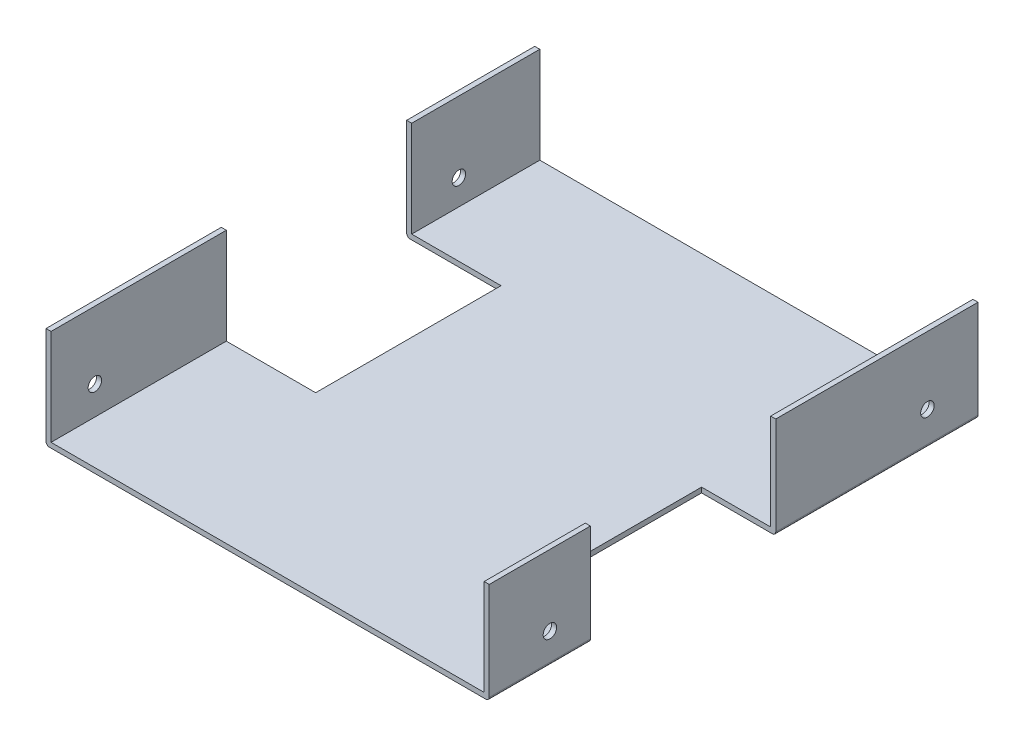
ISO-10303-21;
HEADER;
FILE_DESCRIPTION(('STEP AP214'),'2;1');
FILE_NAME('part.step','',(''),(''),'','','');
FILE_SCHEMA(('AUTOMOTIVE_DESIGN { 1 0 10303 214 1 1 1 1 }'));
ENDSEC;
DATA;
#1=APPLICATION_CONTEXT('core data for automotive mechanical design processes');
#2=APPLICATION_PROTOCOL_DEFINITION('international standard','automotive_design',2000,#1);
#3=PRODUCT_CONTEXT('',#1,'mechanical');
#4=PRODUCT('Part','Part','',(#3));
#5=PRODUCT_RELATED_PRODUCT_CATEGORY('part','',(#4));
#6=PRODUCT_DEFINITION_FORMATION('','',#4);
#7=PRODUCT_DEFINITION_CONTEXT('part definition',#1,'design');
#8=PRODUCT_DEFINITION('design','',#6,#7);
#9=PRODUCT_DEFINITION_SHAPE('','',#8);
#10=(LENGTH_UNIT() NAMED_UNIT(*) SI_UNIT(.MILLI.,.METRE.));
#11=(NAMED_UNIT(*) PLANE_ANGLE_UNIT() SI_UNIT($,.RADIAN.));
#12=(NAMED_UNIT(*) SI_UNIT($,.STERADIAN.) SOLID_ANGLE_UNIT());
#13=UNCERTAINTY_MEASURE_WITH_UNIT(LENGTH_MEASURE(1.E-05),#10,'distance_accuracy_value','');
#14=(GEOMETRIC_REPRESENTATION_CONTEXT(3) GLOBAL_UNCERTAINTY_ASSIGNED_CONTEXT((#13)) GLOBAL_UNIT_ASSIGNED_CONTEXT((#10,
#11,#12)) REPRESENTATION_CONTEXT('',''));
#15=CARTESIAN_POINT('',(0.,0.,0.));
#16=DIRECTION('',(0.,0.,1.));
#17=DIRECTION('',(1.,0.,0.));
#18=AXIS2_PLACEMENT_3D('',#15,#16,#17);
#19=CARTESIAN_POINT('',(-64.75,-15.5,72.5));
#20=DIRECTION('',(0.,1.,0.));
#21=DIRECTION('',(-1.,0.,0.));
#22=AXIS2_PLACEMENT_3D('',#19,#20,#21);
#23=PLANE('',#22);
#24=DIRECTION('',(-1.,0.,0.));
#25=VECTOR('',#24,1.);
#26=CARTESIAN_POINT('',(-64.75,-15.5,42.5));
#27=LINE('',#26,#25);
#28=CARTESIAN_POINT('',(64.75,-15.5,42.5));
#29=VERTEX_POINT('',#28);
#30=CARTESIAN_POINT('',(43.75,-15.5,42.5));
#31=VERTEX_POINT('',#30);
#32=EDGE_CURVE('E206',#29,#31,#27,.T.);
#33=ORIENTED_EDGE('',*,*,#32,.F.);
#34=DIRECTION('',(0.,0.,-1.));
#35=VECTOR('',#34,1.);
#36=CARTESIAN_POINT('',(64.75,-15.5,72.5));
#37=LINE('',#36,#35);
#38=CARTESIAN_POINT('',(64.75,-15.5,72.5));
#39=VERTEX_POINT('',#38);
#40=EDGE_CURVE('E336',#39,#29,#37,.T.);
#41=ORIENTED_EDGE('',*,*,#40,.F.);
#42=DIRECTION('',(1.,0.,0.));
#43=VECTOR('',#42,1.);
#44=CARTESIAN_POINT('',(-64.75,-15.5,72.5));
#45=LINE('',#44,#43);
#46=CARTESIAN_POINT('',(-64.75,-15.5,72.5));
#47=VERTEX_POINT('',#46);
#48=EDGE_CURVE('E265',#47,#39,#45,.T.);
#49=ORIENTED_EDGE('',*,*,#48,.F.);
#50=DIRECTION('',(0.,0.,-1.));
#51=VECTOR('',#50,1.);
#52=CARTESIAN_POINT('',(-64.75,-15.5,72.5));
#53=LINE('',#52,#51);
#54=CARTESIAN_POINT('',(-64.75,-15.5,20.5));
#55=VERTEX_POINT('',#54);
#56=EDGE_CURVE('E340',#47,#55,#53,.T.);
#57=ORIENTED_EDGE('',*,*,#56,.T.);
#58=DIRECTION('',(-1.,0.,0.));
#59=VECTOR('',#58,1.);
#60=CARTESIAN_POINT('',(-64.75,-15.5,20.5));
#61=LINE('',#60,#59);
#62=CARTESIAN_POINT('',(-37.75,-15.5,20.5));
#63=VERTEX_POINT('',#62);
#64=EDGE_CURVE('E244',#63,#55,#61,.T.);
#65=ORIENTED_EDGE('',*,*,#64,.F.);
#66=DIRECTION('',(0.,0.,1.));
#67=VECTOR('',#66,1.);
#68=CARTESIAN_POINT('',(-37.75,-15.5,72.5));
#69=LINE('',#68,#67);
#70=CARTESIAN_POINT('',(-37.75,-15.5,-34.5));
#71=VERTEX_POINT('',#70);
#72=EDGE_CURVE('E256',#71,#63,#69,.T.);
#73=ORIENTED_EDGE('',*,*,#72,.F.);
#74=DIRECTION('',(1.,0.,0.));
#75=VECTOR('',#74,1.);
#76=CARTESIAN_POINT('',(-64.75,-15.5,-34.5));
#77=LINE('',#76,#75);
#78=CARTESIAN_POINT('',(-64.75,-15.5,-34.5));
#79=VERTEX_POINT('',#78);
#80=EDGE_CURVE('E252',#79,#71,#77,.T.);
#81=ORIENTED_EDGE('',*,*,#80,.F.);
#82=CARTESIAN_POINT('',(-64.75,-15.5,-72.5));
#83=VERTEX_POINT('',#82);
#84=EDGE_CURVE('E339',#79,#83,#53,.T.);
#85=ORIENTED_EDGE('',*,*,#84,.T.);
#86=DIRECTION('',(1.,0.,0.));
#87=VECTOR('',#86,1.);
#88=CARTESIAN_POINT('',(-64.75,-15.5,-72.5));
#89=LINE('',#88,#87);
#90=CARTESIAN_POINT('',(64.75,-15.5,-72.5));
#91=VERTEX_POINT('',#90);
#92=EDGE_CURVE('E287',#83,#91,#89,.T.);
#93=ORIENTED_EDGE('',*,*,#92,.T.);
#94=CARTESIAN_POINT('',(64.75,-15.5,-12.5));
#95=VERTEX_POINT('',#94);
#96=EDGE_CURVE('E217',#95,#91,#37,.T.);
#97=ORIENTED_EDGE('',*,*,#96,.F.);
#98=DIRECTION('',(1.,0.,0.));
#99=VECTOR('',#98,1.);
#100=CARTESIAN_POINT('',(-64.75,-15.5,-12.5));
#101=LINE('',#100,#99);
#102=CARTESIAN_POINT('',(43.75,-15.5,-12.5));
#103=VERTEX_POINT('',#102);
#104=EDGE_CURVE('E209',#103,#95,#101,.T.);
#105=ORIENTED_EDGE('',*,*,#104,.F.);
#106=DIRECTION('',(0.,0.,-1.));
#107=VECTOR('',#106,1.);
#108=CARTESIAN_POINT('',(43.75,-15.5,72.5));
#109=LINE('',#108,#107);
#110=EDGE_CURVE('E196',#31,#103,#109,.T.);
#111=ORIENTED_EDGE('',*,*,#110,.F.);
#112=EDGE_LOOP('',(#33,#41,#49,#57,#65,#73,#81,#85,#93,#97,#105,#111));
#113=FACE_BOUND('',#112,.T.);
#114=ADVANCED_FACE('F33',(#113),#23,.F.);
#115=CARTESIAN_POINT('',(-64.25,-14.,72.5));
#116=DIRECTION('',(0.,-1.,0.));
#117=DIRECTION('',(0.,0.,-1.));
#118=AXIS2_PLACEMENT_3D('',#115,#116,#117);
#119=PLANE('',#118);
#120=DIRECTION('',(1.,0.,0.));
#121=VECTOR('',#120,1.);
#122=CARTESIAN_POINT('',(-64.25,-14.,42.5));
#123=LINE('',#122,#121);
#124=CARTESIAN_POINT('',(43.75,-14.,42.5));
#125=VERTEX_POINT('',#124);
#126=CARTESIAN_POINT('',(64.25,-14.,42.5));
#127=VERTEX_POINT('',#126);
#128=EDGE_CURVE('E221',#125,#127,#123,.T.);
#129=ORIENTED_EDGE('',*,*,#128,.F.);
#130=DIRECTION('',(0.,0.,1.));
#131=VECTOR('',#130,1.);
#132=CARTESIAN_POINT('',(43.75,-14.,72.5));
#133=LINE('',#132,#131);
#134=CARTESIAN_POINT('',(43.75,-14.,-12.5));
#135=VERTEX_POINT('',#134);
#136=EDGE_CURVE('E11',#135,#125,#133,.T.);
#137=ORIENTED_EDGE('',*,*,#136,.F.);
#138=DIRECTION('',(-1.,0.,0.));
#139=VECTOR('',#138,1.);
#140=CARTESIAN_POINT('',(-64.25,-14.,-12.5));
#141=LINE('',#140,#139);
#142=CARTESIAN_POINT('',(64.25,-14.,-12.5));
#143=VERTEX_POINT('',#142);
#144=EDGE_CURVE('E212',#143,#135,#141,.T.);
#145=ORIENTED_EDGE('',*,*,#144,.F.);
#146=DIRECTION('',(0.,0.,-1.));
#147=VECTOR('',#146,1.);
#148=CARTESIAN_POINT('',(64.25,-14.,72.5));
#149=LINE('',#148,#147);
#150=CARTESIAN_POINT('',(64.25,-14.,-72.5));
#151=VERTEX_POINT('',#150);
#152=EDGE_CURVE('E320',#143,#151,#149,.T.);
#153=ORIENTED_EDGE('',*,*,#152,.T.);
#154=DIRECTION('',(-1.,0.,0.));
#155=VECTOR('',#154,1.);
#156=CARTESIAN_POINT('',(-64.25,-14.,-72.5));
#157=LINE('',#156,#155);
#158=CARTESIAN_POINT('',(-64.25,-14.,-72.5));
#159=VERTEX_POINT('',#158);
#160=EDGE_CURVE('E301',#151,#159,#157,.T.);
#161=ORIENTED_EDGE('',*,*,#160,.T.);
#162=DIRECTION('',(0.,0.,-1.));
#163=VECTOR('',#162,1.);
#164=CARTESIAN_POINT('',(-64.25,-14.,72.5));
#165=LINE('',#164,#163);
#166=CARTESIAN_POINT('',(-64.25,-14.,-34.5));
#167=VERTEX_POINT('',#166);
#168=EDGE_CURVE('E316',#167,#159,#165,.T.);
#169=ORIENTED_EDGE('',*,*,#168,.F.);
#170=DIRECTION('',(-1.,0.,0.));
#171=VECTOR('',#170,1.);
#172=CARTESIAN_POINT('',(-64.25,-14.,-34.5));
#173=LINE('',#172,#171);
#174=CARTESIAN_POINT('',(-37.75,-14.,-34.5));
#175=VERTEX_POINT('',#174);
#176=EDGE_CURVE('E250',#175,#167,#173,.T.);
#177=ORIENTED_EDGE('',*,*,#176,.F.);
#178=DIRECTION('',(0.,0.,-1.));
#179=VECTOR('',#178,1.);
#180=CARTESIAN_POINT('',(-37.75,-14.,72.5));
#181=LINE('',#180,#179);
#182=CARTESIAN_POINT('',(-37.75,-14.,20.5));
#183=VERTEX_POINT('',#182);
#184=EDGE_CURVE('E351',#183,#175,#181,.T.);
#185=ORIENTED_EDGE('',*,*,#184,.F.);
#186=DIRECTION('',(1.,0.,0.));
#187=VECTOR('',#186,1.);
#188=CARTESIAN_POINT('',(-64.25,-14.,20.5));
#189=LINE('',#188,#187);
#190=CARTESIAN_POINT('',(-64.25,-14.,20.5));
#191=VERTEX_POINT('',#190);
#192=EDGE_CURVE('E242',#191,#183,#189,.T.);
#193=ORIENTED_EDGE('',*,*,#192,.F.);
#194=CARTESIAN_POINT('',(-64.25,-14.,72.5));
#195=VERTEX_POINT('',#194);
#196=EDGE_CURVE('E317',#195,#191,#165,.T.);
#197=ORIENTED_EDGE('',*,*,#196,.F.);
#198=DIRECTION('',(-1.,0.,0.));
#199=VECTOR('',#198,1.);
#200=CARTESIAN_POINT('',(-64.25,-14.,72.5));
#201=LINE('',#200,#199);
#202=CARTESIAN_POINT('',(64.25,-14.,72.5));
#203=VERTEX_POINT('',#202);
#204=EDGE_CURVE('E275',#203,#195,#201,.T.);
#205=ORIENTED_EDGE('',*,*,#204,.F.);
#206=EDGE_CURVE('E321',#203,#127,#149,.T.);
#207=ORIENTED_EDGE('',*,*,#206,.T.);
#208=EDGE_LOOP('',(#129,#137,#145,#153,#161,#169,#177,#185,#193,#197,#205,#207));
#209=FACE_BOUND('',#208,.T.);
#210=ADVANCED_FACE('F433',(#209),#119,.F.);
#211=CARTESIAN_POINT('',(64.75,-14.5,72.5));
#212=DIRECTION('',(0.,0.,-1.));
#213=DIRECTION('',(-1.,0.,0.));
#214=AXIS2_PLACEMENT_3D('',#211,#212,#213);
#215=CYLINDRICAL_SURFACE('',#214,1.00000000000003);
#216=CARTESIAN_POINT('',(64.75,-14.5,42.5));
#217=DIRECTION('',(0.,0.,-1.));
#218=DIRECTION('',(-1.,0.,0.));
#219=AXIS2_PLACEMENT_3D('',#216,#217,#218);
#220=CIRCLE('',#219,1.00000000000003);
#221=CARTESIAN_POINT('',(65.75,-14.5,42.5));
#222=VERTEX_POINT('',#221);
#223=EDGE_CURVE('E227',#222,#29,#220,.T.);
#224=ORIENTED_EDGE('',*,*,#223,.F.);
#225=DIRECTION('',(0.,0.,-1.));
#226=VECTOR('',#225,1.);
#227=CARTESIAN_POINT('',(65.75,-14.5,72.5));
#228=LINE('',#227,#226);
#229=CARTESIAN_POINT('',(65.75,-14.5,72.5));
#230=VERTEX_POINT('',#229);
#231=EDGE_CURVE('E333',#230,#222,#228,.T.);
#232=ORIENTED_EDGE('',*,*,#231,.F.);
#233=CARTESIAN_POINT('',(64.75,-14.5,72.5));
#234=DIRECTION('',(0.,0.,1.));
#235=DIRECTION('',(-1.,0.,0.));
#236=AXIS2_PLACEMENT_3D('',#233,#234,#235);
#237=CIRCLE('',#236,1.00000000000003);
#238=EDGE_CURVE('E267',#39,#230,#237,.T.);
#239=ORIENTED_EDGE('',*,*,#238,.F.);
#240=ORIENTED_EDGE('',*,*,#40,.T.);
#241=EDGE_LOOP('',(#224,#232,#239,#240));
#242=FACE_BOUND('',#241,.T.);
#243=ADVANCED_FACE('F405',(#242),#215,.T.);
#244=CARTESIAN_POINT('',(64.75,-14.5,-12.5));
#245=DIRECTION('',(0.,0.,1.));
#246=DIRECTION('',(1.,0.,0.));
#247=AXIS2_PLACEMENT_3D('',#244,#245,#246);
#248=CIRCLE('',#247,1.00000000000003);
#249=CARTESIAN_POINT('',(65.75,-14.5,-12.5));
#250=VERTEX_POINT('',#249);
#251=EDGE_CURVE('E219',#95,#250,#248,.T.);
#252=ORIENTED_EDGE('',*,*,#251,.F.);
#253=ORIENTED_EDGE('',*,*,#96,.T.);
#254=CARTESIAN_POINT('',(64.75,-14.5,-72.5));
#255=DIRECTION('',(0.,0.,1.));
#256=DIRECTION('',(-1.,0.,0.));
#257=AXIS2_PLACEMENT_3D('',#254,#255,#256);
#258=CIRCLE('',#257,1.00000000000003);
#259=CARTESIAN_POINT('',(65.75,-14.5,-72.5));
#260=VERTEX_POINT('',#259);
#261=EDGE_CURVE('E289',#91,#260,#258,.T.);
#262=ORIENTED_EDGE('',*,*,#261,.T.);
#263=EDGE_CURVE('E332',#250,#260,#228,.T.);
#264=ORIENTED_EDGE('',*,*,#263,.F.);
#265=EDGE_LOOP('',(#252,#253,#262,#264));
#266=FACE_BOUND('',#265,.T.);
#267=ADVANCED_FACE('F456',(#266),#215,.T.);
#268=CARTESIAN_POINT('',(65.75,14.5,72.5));
#269=DIRECTION('',(-1.,0.,0.));
#270=DIRECTION('',(0.,-1.,0.));
#271=AXIS2_PLACEMENT_3D('',#268,#269,#270);
#272=PLANE('',#271);
#273=CARTESIAN_POINT('',(65.75,-6.5,54.5));
#274=DIRECTION('',(1.,0.,0.));
#275=DIRECTION('',(0.,1.,0.));
#276=AXIS2_PLACEMENT_3D('',#273,#274,#275);
#277=CIRCLE('',#276,2.);
#278=CARTESIAN_POINT('',(65.75,-4.5,54.5));
#279=VERTEX_POINT('',#278);
#280=EDGE_CURVE('E365',#279,#279,#277,.T.);
#281=ORIENTED_EDGE('',*,*,#280,.F.);
#282=EDGE_LOOP('',(#281));
#283=FACE_BOUND('',#282,.T.);
#284=DIRECTION('',(0.,1.,0.));
#285=VECTOR('',#284,1.);
#286=CARTESIAN_POINT('',(65.75,-46.5,42.5));
#287=LINE('',#286,#285);
#288=CARTESIAN_POINT('',(65.75,14.5,42.5));
#289=VERTEX_POINT('',#288);
#290=EDGE_CURVE('E382',#222,#289,#287,.T.);
#291=ORIENTED_EDGE('',*,*,#290,.T.);
#292=DIRECTION('',(0.,0.,-1.));
#293=VECTOR('',#292,1.);
#294=CARTESIAN_POINT('',(65.75,14.5,72.5));
#295=LINE('',#294,#293);
#296=CARTESIAN_POINT('',(65.75,14.5,72.5));
#297=VERTEX_POINT('',#296);
#298=EDGE_CURVE('E329',#297,#289,#295,.T.);
#299=ORIENTED_EDGE('',*,*,#298,.F.);
#300=DIRECTION('',(0.,1.,0.));
#301=VECTOR('',#300,1.);
#302=CARTESIAN_POINT('',(65.75,14.5,72.5));
#303=LINE('',#302,#301);
#304=EDGE_CURVE('E269',#230,#297,#303,.T.);
#305=ORIENTED_EDGE('',*,*,#304,.F.);
#306=ORIENTED_EDGE('',*,*,#231,.T.);
#307=EDGE_LOOP('',(#291,#299,#305,#306));
#308=FACE_BOUND('',#307,.T.);
#309=ADVANCED_FACE('F387',(#283,#308),#272,.F.);
#310=CARTESIAN_POINT('',(65.75,-5.5,-57.5));
#311=DIRECTION('',(1.,0.,0.));
#312=DIRECTION('',(0.,1.,0.));
#313=AXIS2_PLACEMENT_3D('',#310,#311,#312);
#314=CIRCLE('',#313,2.);
#315=CARTESIAN_POINT('',(65.75,-3.5,-57.5));
#316=VERTEX_POINT('',#315);
#317=EDGE_CURVE('E373',#316,#316,#314,.T.);
#318=ORIENTED_EDGE('',*,*,#317,.F.);
#319=EDGE_LOOP('',(#318));
#320=FACE_BOUND('',#319,.T.);
#321=DIRECTION('',(0.,1.,0.));
#322=VECTOR('',#321,1.);
#323=CARTESIAN_POINT('',(65.75,-46.5,-12.5));
#324=LINE('',#323,#322);
#325=CARTESIAN_POINT('',(65.75,14.5,-12.5));
#326=VERTEX_POINT('',#325);
#327=EDGE_CURVE('E213',#250,#326,#324,.T.);
#328=ORIENTED_EDGE('',*,*,#327,.F.);
#329=ORIENTED_EDGE('',*,*,#263,.T.);
#330=DIRECTION('',(0.,1.,0.));
#331=VECTOR('',#330,1.);
#332=CARTESIAN_POINT('',(65.75,14.5,-72.5));
#333=LINE('',#332,#331);
#334=CARTESIAN_POINT('',(65.75,14.5,-72.5));
#335=VERTEX_POINT('',#334);
#336=EDGE_CURVE('E292',#260,#335,#333,.T.);
#337=ORIENTED_EDGE('',*,*,#336,.T.);
#338=EDGE_CURVE('E328',#326,#335,#295,.T.);
#339=ORIENTED_EDGE('',*,*,#338,.F.);
#340=EDGE_LOOP('',(#328,#329,#337,#339));
#341=FACE_BOUND('',#340,.T.);
#342=ADVANCED_FACE('F460',(#320,#341),#272,.F.);
#343=CARTESIAN_POINT('',(64.25,14.5,72.5));
#344=DIRECTION('',(0.,-1.,0.));
#345=DIRECTION('',(1.,0.,0.));
#346=AXIS2_PLACEMENT_3D('',#343,#344,#345);
#347=PLANE('',#346);
#348=DIRECTION('',(1.,0.,0.));
#349=VECTOR('',#348,1.);
#350=CARTESIAN_POINT('',(64.25,14.5,42.5));
#351=LINE('',#350,#349);
#352=CARTESIAN_POINT('',(64.25,14.5,42.5));
#353=VERTEX_POINT('',#352);
#354=EDGE_CURVE('E218',#353,#289,#351,.T.);
#355=ORIENTED_EDGE('',*,*,#354,.F.);
#356=DIRECTION('',(0.,0.,-1.));
#357=VECTOR('',#356,1.);
#358=CARTESIAN_POINT('',(64.25,14.5,72.5));
#359=LINE('',#358,#357);
#360=CARTESIAN_POINT('',(64.25,14.5,72.5));
#361=VERTEX_POINT('',#360);
#362=EDGE_CURVE('E325',#361,#353,#359,.T.);
#363=ORIENTED_EDGE('',*,*,#362,.F.);
#364=DIRECTION('',(-1.,0.,0.));
#365=VECTOR('',#364,1.);
#366=CARTESIAN_POINT('',(64.25,14.5,72.5));
#367=LINE('',#366,#365);
#368=EDGE_CURVE('E271',#297,#361,#367,.T.);
#369=ORIENTED_EDGE('',*,*,#368,.F.);
#370=ORIENTED_EDGE('',*,*,#298,.T.);
#371=EDGE_LOOP('',(#355,#363,#369,#370));
#372=FACE_BOUND('',#371,.T.);
#373=ADVANCED_FACE('F395',(#372),#347,.F.);
#374=DIRECTION('',(-1.,0.,0.));
#375=VECTOR('',#374,1.);
#376=CARTESIAN_POINT('',(64.25,14.5,-12.5));
#377=LINE('',#376,#375);
#378=CARTESIAN_POINT('',(64.25,14.5,-12.5));
#379=VERTEX_POINT('',#378);
#380=EDGE_CURVE('E50',#326,#379,#377,.T.);
#381=ORIENTED_EDGE('',*,*,#380,.F.);
#382=ORIENTED_EDGE('',*,*,#338,.T.);
#383=DIRECTION('',(-1.,0.,0.));
#384=VECTOR('',#383,1.);
#385=CARTESIAN_POINT('',(64.25,14.5,-72.5));
#386=LINE('',#385,#384);
#387=CARTESIAN_POINT('',(64.25,14.5,-72.5));
#388=VERTEX_POINT('',#387);
#389=EDGE_CURVE('E295',#335,#388,#386,.T.);
#390=ORIENTED_EDGE('',*,*,#389,.T.);
#391=EDGE_CURVE('E324',#379,#388,#359,.T.);
#392=ORIENTED_EDGE('',*,*,#391,.F.);
#393=EDGE_LOOP('',(#381,#382,#390,#392));
#394=FACE_BOUND('',#393,.T.);
#395=ADVANCED_FACE('F462',(#394),#347,.F.);
#396=CARTESIAN_POINT('',(64.25,-14.,72.5));
#397=DIRECTION('',(1.,0.,0.));
#398=DIRECTION('',(0.,1.,0.));
#399=AXIS2_PLACEMENT_3D('',#396,#397,#398);
#400=PLANE('',#399);
#401=CARTESIAN_POINT('',(64.25,-6.5,54.5));
#402=DIRECTION('',(1.,0.,0.));
#403=DIRECTION('',(0.,1.,0.));
#404=AXIS2_PLACEMENT_3D('',#401,#402,#403);
#405=CIRCLE('',#404,2.);
#406=CARTESIAN_POINT('',(64.25,-4.5,54.5));
#407=VERTEX_POINT('',#406);
#408=EDGE_CURVE('E363',#407,#407,#405,.T.);
#409=ORIENTED_EDGE('',*,*,#408,.T.);
#410=EDGE_LOOP('',(#409));
#411=FACE_BOUND('',#410,.T.);
#412=DIRECTION('',(0.,1.,0.));
#413=VECTOR('',#412,1.);
#414=CARTESIAN_POINT('',(64.25,-14.,42.5));
#415=LINE('',#414,#413);
#416=EDGE_CURVE('E42',#127,#353,#415,.T.);
#417=ORIENTED_EDGE('',*,*,#416,.F.);
#418=ORIENTED_EDGE('',*,*,#206,.F.);
#419=DIRECTION('',(0.,-1.,0.));
#420=VECTOR('',#419,1.);
#421=CARTESIAN_POINT('',(64.25,-14.,72.5));
#422=LINE('',#421,#420);
#423=EDGE_CURVE('E273',#361,#203,#422,.T.);
#424=ORIENTED_EDGE('',*,*,#423,.F.);
#425=ORIENTED_EDGE('',*,*,#362,.T.);
#426=EDGE_LOOP('',(#417,#418,#424,#425));
#427=FACE_BOUND('',#426,.T.);
#428=ADVANCED_FACE('F471',(#411,#427),#400,.F.);
#429=CARTESIAN_POINT('',(64.25,-5.5,-57.5));
#430=DIRECTION('',(1.,0.,0.));
#431=DIRECTION('',(0.,1.,0.));
#432=AXIS2_PLACEMENT_3D('',#429,#430,#431);
#433=CIRCLE('',#432,2.);
#434=CARTESIAN_POINT('',(64.25,-3.5,-57.5));
#435=VERTEX_POINT('',#434);
#436=EDGE_CURVE('E37',#435,#435,#433,.T.);
#437=ORIENTED_EDGE('',*,*,#436,.T.);
#438=EDGE_LOOP('',(#437));
#439=FACE_BOUND('',#438,.T.);
#440=DIRECTION('',(0.,-1.,0.));
#441=VECTOR('',#440,1.);
#442=CARTESIAN_POINT('',(64.25,-14.,-12.5));
#443=LINE('',#442,#441);
#444=EDGE_CURVE('E353',#379,#143,#443,.T.);
#445=ORIENTED_EDGE('',*,*,#444,.F.);
#446=ORIENTED_EDGE('',*,*,#391,.T.);
#447=DIRECTION('',(0.,-1.,0.));
#448=VECTOR('',#447,1.);
#449=CARTESIAN_POINT('',(64.25,-14.,-72.5));
#450=LINE('',#449,#448);
#451=EDGE_CURVE('E298',#388,#151,#450,.T.);
#452=ORIENTED_EDGE('',*,*,#451,.T.);
#453=ORIENTED_EDGE('',*,*,#152,.F.);
#454=EDGE_LOOP('',(#445,#446,#452,#453));
#455=FACE_BOUND('',#454,.T.);
#456=ADVANCED_FACE('F466',(#439,#455),#400,.F.);
#457=CARTESIAN_POINT('',(-65.75,14.5,72.5));
#458=DIRECTION('',(1.,0.,0.));
#459=DIRECTION('',(0.,0.,-1.));
#460=AXIS2_PLACEMENT_3D('',#457,#458,#459);
#461=PLANE('',#460);
#462=CARTESIAN_POINT('',(-65.75,-6.5,-48.5));
#463=DIRECTION('',(1.,0.,0.));
#464=DIRECTION('',(0.,0.,-1.));
#465=AXIS2_PLACEMENT_3D('',#462,#463,#464);
#466=CIRCLE('',#465,2.);
#467=CARTESIAN_POINT('',(-65.75,-6.5,-50.5));
#468=VERTEX_POINT('',#467);
#469=EDGE_CURVE('E360',#468,#468,#466,.F.);
#470=ORIENTED_EDGE('',*,*,#469,.F.);
#471=EDGE_LOOP('',(#470));
#472=FACE_BOUND('',#471,.T.);
#473=DIRECTION('',(0.,1.,0.));
#474=VECTOR('',#473,1.);
#475=CARTESIAN_POINT('',(-65.75,-46.5,-34.5));
#476=LINE('',#475,#474);
#477=CARTESIAN_POINT('',(-65.75,-14.5,-34.5));
#478=VERTEX_POINT('',#477);
#479=CARTESIAN_POINT('',(-65.75,14.5,-34.5));
#480=VERTEX_POINT('',#479);
#481=EDGE_CURVE('E237',#478,#480,#476,.T.);
#482=ORIENTED_EDGE('',*,*,#481,.T.);
#483=DIRECTION('',(0.,0.,-1.));
#484=VECTOR('',#483,1.);
#485=CARTESIAN_POINT('',(-65.75,14.5,72.5));
#486=LINE('',#485,#484);
#487=CARTESIAN_POINT('',(-65.75,14.5,-72.5));
#488=VERTEX_POINT('',#487);
#489=EDGE_CURVE('E281',#480,#488,#486,.T.);
#490=ORIENTED_EDGE('',*,*,#489,.T.);
#491=DIRECTION('',(0.,-1.,0.));
#492=VECTOR('',#491,1.);
#493=CARTESIAN_POINT('',(-65.75,14.5,-72.5));
#494=LINE('',#493,#492);
#495=CARTESIAN_POINT('',(-65.75,-14.5,-72.5));
#496=VERTEX_POINT('',#495);
#497=EDGE_CURVE('E258',#488,#496,#494,.T.);
#498=ORIENTED_EDGE('',*,*,#497,.T.);
#499=DIRECTION('',(0.,0.,-1.));
#500=VECTOR('',#499,1.);
#501=CARTESIAN_POINT('',(-65.75,-14.5,72.5));
#502=LINE('',#501,#500);
#503=EDGE_CURVE('E343',#478,#496,#502,.T.);
#504=ORIENTED_EDGE('',*,*,#503,.F.);
#505=EDGE_LOOP('',(#482,#490,#498,#504));
#506=FACE_BOUND('',#505,.T.);
#507=ADVANCED_FACE('F35',(#472,#506),#461,.F.);
#508=CARTESIAN_POINT('',(-65.75,-5.5,59.5));
#509=DIRECTION('',(1.,0.,0.));
#510=DIRECTION('',(0.,0.,-1.));
#511=AXIS2_PLACEMENT_3D('',#508,#509,#510);
#512=CIRCLE('',#511,2.);
#513=CARTESIAN_POINT('',(-65.75,-5.5,57.5));
#514=VERTEX_POINT('',#513);
#515=EDGE_CURVE('E359',#514,#514,#512,.F.);
#516=ORIENTED_EDGE('',*,*,#515,.F.);
#517=EDGE_LOOP('',(#516));
#518=FACE_BOUND('',#517,.T.);
#519=DIRECTION('',(0.,1.,0.));
#520=VECTOR('',#519,1.);
#521=CARTESIAN_POINT('',(-65.75,-46.5,20.5));
#522=LINE('',#521,#520);
#523=CARTESIAN_POINT('',(-65.75,-14.5,20.5));
#524=VERTEX_POINT('',#523);
#525=CARTESIAN_POINT('',(-65.75,14.5,20.5));
#526=VERTEX_POINT('',#525);
#527=EDGE_CURVE('E58',#524,#526,#522,.T.);
#528=ORIENTED_EDGE('',*,*,#527,.F.);
#529=CARTESIAN_POINT('',(-65.75,-14.5,72.5));
#530=VERTEX_POINT('',#529);
#531=EDGE_CURVE('E344',#530,#524,#502,.T.);
#532=ORIENTED_EDGE('',*,*,#531,.F.);
#533=DIRECTION('',(0.,-1.,0.));
#534=VECTOR('',#533,1.);
#535=CARTESIAN_POINT('',(-65.75,14.5,72.5));
#536=LINE('',#535,#534);
#537=CARTESIAN_POINT('',(-65.75,14.5,72.5));
#538=VERTEX_POINT('',#537);
#539=EDGE_CURVE('E259',#538,#530,#536,.T.);
#540=ORIENTED_EDGE('',*,*,#539,.F.);
#541=EDGE_CURVE('E309',#538,#526,#486,.T.);
#542=ORIENTED_EDGE('',*,*,#541,.T.);
#543=EDGE_LOOP('',(#528,#532,#540,#542));
#544=FACE_BOUND('',#543,.T.);
#545=ADVANCED_FACE('F417',(#518,#544),#461,.F.);
#546=CARTESIAN_POINT('',(-64.75,-14.5,72.5));
#547=DIRECTION('',(0.,0.,-1.));
#548=DIRECTION('',(-1.,0.,0.));
#549=AXIS2_PLACEMENT_3D('',#546,#547,#548);
#550=CYLINDRICAL_SURFACE('',#549,1.);
#551=CARTESIAN_POINT('',(-64.75,-14.5,-34.5));
#552=DIRECTION('',(0.,0.,1.));
#553=DIRECTION('',(1.,0.,0.));
#554=AXIS2_PLACEMENT_3D('',#551,#552,#553);
#555=CIRCLE('',#554,1.);
#556=EDGE_CURVE('E254',#478,#79,#555,.T.);
#557=ORIENTED_EDGE('',*,*,#556,.F.);
#558=ORIENTED_EDGE('',*,*,#503,.T.);
#559=CARTESIAN_POINT('',(-64.75,-14.5,-72.5));
#560=DIRECTION('',(0.,0.,1.));
#561=DIRECTION('',(1.,0.,0.));
#562=AXIS2_PLACEMENT_3D('',#559,#560,#561);
#563=CIRCLE('',#562,1.);
#564=EDGE_CURVE('E284',#496,#83,#563,.T.);
#565=ORIENTED_EDGE('',*,*,#564,.T.);
#566=ORIENTED_EDGE('',*,*,#84,.F.);
#567=EDGE_LOOP('',(#557,#558,#565,#566));
#568=FACE_BOUND('',#567,.T.);
#569=ADVANCED_FACE('F444',(#568),#550,.T.);
#570=CARTESIAN_POINT('',(-64.75,-14.5,20.5));
#571=DIRECTION('',(0.,0.,-1.));
#572=DIRECTION('',(-1.,0.,0.));
#573=AXIS2_PLACEMENT_3D('',#570,#571,#572);
#574=CIRCLE('',#573,1.);
#575=EDGE_CURVE('E246',#55,#524,#574,.T.);
#576=ORIENTED_EDGE('',*,*,#575,.F.);
#577=ORIENTED_EDGE('',*,*,#56,.F.);
#578=CARTESIAN_POINT('',(-64.75,-14.5,72.5));
#579=DIRECTION('',(0.,0.,1.));
#580=DIRECTION('',(1.,0.,0.));
#581=AXIS2_PLACEMENT_3D('',#578,#579,#580);
#582=CIRCLE('',#581,1.);
#583=EDGE_CURVE('E262',#530,#47,#582,.T.);
#584=ORIENTED_EDGE('',*,*,#583,.F.);
#585=ORIENTED_EDGE('',*,*,#531,.T.);
#586=EDGE_LOOP('',(#576,#577,#584,#585));
#587=FACE_BOUND('',#586,.T.);
#588=ADVANCED_FACE('F412',(#587),#550,.T.);
#589=CARTESIAN_POINT('',(-64.25,14.5,72.5));
#590=DIRECTION('',(-1.,0.,0.));
#591=DIRECTION('',(0.,0.,1.));
#592=AXIS2_PLACEMENT_3D('',#589,#590,#591);
#593=PLANE('',#592);
#594=CARTESIAN_POINT('',(-64.25,-6.5,-48.5));
#595=DIRECTION('',(-1.,0.,0.));
#596=DIRECTION('',(0.,0.,1.));
#597=AXIS2_PLACEMENT_3D('',#594,#595,#596);
#598=CIRCLE('',#597,2.);
#599=CARTESIAN_POINT('',(-64.25,-6.5,-46.5));
#600=VERTEX_POINT('',#599);
#601=EDGE_CURVE('E361',#600,#600,#598,.F.);
#602=ORIENTED_EDGE('',*,*,#601,.F.);
#603=EDGE_LOOP('',(#602));
#604=FACE_BOUND('',#603,.T.);
#605=DIRECTION('',(0.,1.,0.));
#606=VECTOR('',#605,1.);
#607=CARTESIAN_POINT('',(-64.25,14.5,-34.5));
#608=LINE('',#607,#606);
#609=CARTESIAN_POINT('',(-64.25,14.5,-34.5));
#610=VERTEX_POINT('',#609);
#611=EDGE_CURVE('E248',#167,#610,#608,.T.);
#612=ORIENTED_EDGE('',*,*,#611,.F.);
#613=ORIENTED_EDGE('',*,*,#168,.T.);
#614=DIRECTION('',(0.,1.,0.));
#615=VECTOR('',#614,1.);
#616=CARTESIAN_POINT('',(-64.25,14.5,-72.5));
#617=LINE('',#616,#615);
#618=CARTESIAN_POINT('',(-64.25,14.5,-72.5));
#619=VERTEX_POINT('',#618);
#620=EDGE_CURVE('E304',#159,#619,#617,.T.);
#621=ORIENTED_EDGE('',*,*,#620,.T.);
#622=DIRECTION('',(0.,0.,-1.));
#623=VECTOR('',#622,1.);
#624=CARTESIAN_POINT('',(-64.25,14.5,72.5));
#625=LINE('',#624,#623);
#626=EDGE_CURVE('E312',#610,#619,#625,.T.);
#627=ORIENTED_EDGE('',*,*,#626,.F.);
#628=EDGE_LOOP('',(#612,#613,#621,#627));
#629=FACE_BOUND('',#628,.T.);
#630=ADVANCED_FACE('F493',(#604,#629),#593,.F.);
#631=CARTESIAN_POINT('',(-64.25,-5.5,59.5));
#632=DIRECTION('',(-1.,0.,0.));
#633=DIRECTION('',(0.,0.,1.));
#634=AXIS2_PLACEMENT_3D('',#631,#632,#633);
#635=CIRCLE('',#634,2.);
#636=CARTESIAN_POINT('',(-64.25,-5.5,61.5));
#637=VERTEX_POINT('',#636);
#638=EDGE_CURVE('E356',#637,#637,#635,.F.);
#639=ORIENTED_EDGE('',*,*,#638,.F.);
#640=EDGE_LOOP('',(#639));
#641=FACE_BOUND('',#640,.T.);
#642=DIRECTION('',(0.,-1.,0.));
#643=VECTOR('',#642,1.);
#644=CARTESIAN_POINT('',(-64.25,14.5,20.5));
#645=LINE('',#644,#643);
#646=CARTESIAN_POINT('',(-64.25,14.5,20.5));
#647=VERTEX_POINT('',#646);
#648=EDGE_CURVE('E240',#647,#191,#645,.T.);
#649=ORIENTED_EDGE('',*,*,#648,.F.);
#650=CARTESIAN_POINT('',(-64.25,14.5,72.5));
#651=VERTEX_POINT('',#650);
#652=EDGE_CURVE('E313',#651,#647,#625,.T.);
#653=ORIENTED_EDGE('',*,*,#652,.F.);
#654=DIRECTION('',(0.,1.,0.));
#655=VECTOR('',#654,1.);
#656=CARTESIAN_POINT('',(-64.25,14.5,72.5));
#657=LINE('',#656,#655);
#658=EDGE_CURVE('E277',#195,#651,#657,.T.);
#659=ORIENTED_EDGE('',*,*,#658,.F.);
#660=ORIENTED_EDGE('',*,*,#196,.T.);
#661=EDGE_LOOP('',(#649,#653,#659,#660));
#662=FACE_BOUND('',#661,.T.);
#663=ADVANCED_FACE('F427',(#641,#662),#593,.F.);
#664=CARTESIAN_POINT('',(-65.75,14.5,72.5));
#665=DIRECTION('',(0.,-1.,0.));
#666=DIRECTION('',(0.,0.,-1.));
#667=AXIS2_PLACEMENT_3D('',#664,#665,#666);
#668=PLANE('',#667);
#669=DIRECTION('',(-1.,0.,0.));
#670=VECTOR('',#669,1.);
#671=CARTESIAN_POINT('',(-65.75,14.5,-34.5));
#672=LINE('',#671,#670);
#673=EDGE_CURVE('E349',#610,#480,#672,.T.);
#674=ORIENTED_EDGE('',*,*,#673,.F.);
#675=ORIENTED_EDGE('',*,*,#626,.T.);
#676=DIRECTION('',(-1.,0.,0.));
#677=VECTOR('',#676,1.);
#678=CARTESIAN_POINT('',(-65.75,14.5,-72.5));
#679=LINE('',#678,#677);
#680=EDGE_CURVE('E263',#619,#488,#679,.T.);
#681=ORIENTED_EDGE('',*,*,#680,.T.);
#682=ORIENTED_EDGE('',*,*,#489,.F.);
#683=EDGE_LOOP('',(#674,#675,#681,#682));
#684=FACE_BOUND('',#683,.T.);
#685=ADVANCED_FACE('F531',(#684),#668,.F.);
#686=DIRECTION('',(1.,0.,0.));
#687=VECTOR('',#686,1.);
#688=CARTESIAN_POINT('',(-65.75,14.5,20.5));
#689=LINE('',#688,#687);
#690=EDGE_CURVE('E347',#526,#647,#689,.T.);
#691=ORIENTED_EDGE('',*,*,#690,.F.);
#692=ORIENTED_EDGE('',*,*,#541,.F.);
#693=DIRECTION('',(-1.,0.,0.));
#694=VECTOR('',#693,1.);
#695=CARTESIAN_POINT('',(-65.75,14.5,72.5));
#696=LINE('',#695,#694);
#697=EDGE_CURVE('E279',#651,#538,#696,.T.);
#698=ORIENTED_EDGE('',*,*,#697,.F.);
#699=ORIENTED_EDGE('',*,*,#652,.T.);
#700=EDGE_LOOP('',(#691,#692,#698,#699));
#701=FACE_BOUND('',#700,.T.);
#702=ADVANCED_FACE('F422',(#701),#668,.F.);
#703=CARTESIAN_POINT('',(-64.75,-14.5,72.5));
#704=DIRECTION('',(0.,0.,1.));
#705=DIRECTION('',(1.,0.,0.));
#706=AXIS2_PLACEMENT_3D('',#703,#704,#705);
#707=PLANE('',#706);
#708=ORIENTED_EDGE('',*,*,#539,.T.);
#709=ORIENTED_EDGE('',*,*,#583,.T.);
#710=ORIENTED_EDGE('',*,*,#48,.T.);
#711=ORIENTED_EDGE('',*,*,#238,.T.);
#712=ORIENTED_EDGE('',*,*,#304,.T.);
#713=ORIENTED_EDGE('',*,*,#368,.T.);
#714=ORIENTED_EDGE('',*,*,#423,.T.);
#715=ORIENTED_EDGE('',*,*,#204,.T.);
#716=ORIENTED_EDGE('',*,*,#658,.T.);
#717=ORIENTED_EDGE('',*,*,#697,.T.);
#718=EDGE_LOOP('',(#708,#709,#710,#711,#712,#713,#714,#715,#716,#717));
#719=FACE_BOUND('',#718,.T.);
#720=ADVANCED_FACE('F399',(#719),#707,.T.);
#721=CARTESIAN_POINT('',(-64.75,-14.5,-72.5));
#722=DIRECTION('',(0.,0.,1.));
#723=DIRECTION('',(1.,0.,0.));
#724=AXIS2_PLACEMENT_3D('',#721,#722,#723);
#725=PLANE('',#724);
#726=ORIENTED_EDGE('',*,*,#497,.F.);
#727=ORIENTED_EDGE('',*,*,#680,.F.);
#728=ORIENTED_EDGE('',*,*,#620,.F.);
#729=ORIENTED_EDGE('',*,*,#160,.F.);
#730=ORIENTED_EDGE('',*,*,#451,.F.);
#731=ORIENTED_EDGE('',*,*,#389,.F.);
#732=ORIENTED_EDGE('',*,*,#336,.F.);
#733=ORIENTED_EDGE('',*,*,#261,.F.);
#734=ORIENTED_EDGE('',*,*,#92,.F.);
#735=ORIENTED_EDGE('',*,*,#564,.F.);
#736=EDGE_LOOP('',(#726,#727,#728,#729,#730,#731,#732,#733,#734,#735));
#737=FACE_BOUND('',#736,.T.);
#738=ADVANCED_FACE('F451',(#737),#725,.F.);
#739=CARTESIAN_POINT('',(-37.75,-46.5,20.5));
#740=DIRECTION('',(-1.,0.,0.));
#741=DIRECTION('',(0.,-1.,0.));
#742=AXIS2_PLACEMENT_3D('',#739,#740,#741);
#743=PLANE('',#742);
#744=ORIENTED_EDGE('',*,*,#72,.T.);
#745=DIRECTION('',(0.,1.,0.));
#746=VECTOR('',#745,1.);
#747=CARTESIAN_POINT('',(-37.75,-46.5,20.5));
#748=LINE('',#747,#746);
#749=EDGE_CURVE('E231',#63,#183,#748,.T.);
#750=ORIENTED_EDGE('',*,*,#749,.T.);
#751=ORIENTED_EDGE('',*,*,#184,.T.);
#752=DIRECTION('',(0.,1.,0.));
#753=VECTOR('',#752,1.);
#754=CARTESIAN_POINT('',(-37.75,-46.5,-34.5));
#755=LINE('',#754,#753);
#756=EDGE_CURVE('E234',#71,#175,#755,.T.);
#757=ORIENTED_EDGE('',*,*,#756,.F.);
#758=EDGE_LOOP('',(#744,#750,#751,#757));
#759=FACE_BOUND('',#758,.T.);
#760=ADVANCED_FACE('F437',(#759),#743,.T.);
#761=CARTESIAN_POINT('',(-37.75,-46.5,-34.5));
#762=DIRECTION('',(0.,0.,1.));
#763=DIRECTION('',(1.,0.,0.));
#764=AXIS2_PLACEMENT_3D('',#761,#762,#763);
#765=PLANE('',#764);
#766=ORIENTED_EDGE('',*,*,#556,.T.);
#767=ORIENTED_EDGE('',*,*,#80,.T.);
#768=ORIENTED_EDGE('',*,*,#756,.T.);
#769=ORIENTED_EDGE('',*,*,#176,.T.);
#770=ORIENTED_EDGE('',*,*,#611,.T.);
#771=ORIENTED_EDGE('',*,*,#673,.T.);
#772=ORIENTED_EDGE('',*,*,#481,.F.);
#773=EDGE_LOOP('',(#766,#767,#768,#769,#770,#771,#772));
#774=FACE_BOUND('',#773,.T.);
#775=ADVANCED_FACE('F522',(#774),#765,.T.);
#776=CARTESIAN_POINT('',(-65.75,-46.5,20.5));
#777=DIRECTION('',(0.,0.,-1.));
#778=DIRECTION('',(-1.,0.,0.));
#779=AXIS2_PLACEMENT_3D('',#776,#777,#778);
#780=PLANE('',#779);
#781=ORIENTED_EDGE('',*,*,#575,.T.);
#782=ORIENTED_EDGE('',*,*,#527,.T.);
#783=ORIENTED_EDGE('',*,*,#690,.T.);
#784=ORIENTED_EDGE('',*,*,#648,.T.);
#785=ORIENTED_EDGE('',*,*,#192,.T.);
#786=ORIENTED_EDGE('',*,*,#749,.F.);
#787=ORIENTED_EDGE('',*,*,#64,.T.);
#788=EDGE_LOOP('',(#781,#782,#783,#784,#785,#786,#787));
#789=FACE_BOUND('',#788,.T.);
#790=ADVANCED_FACE('F414',(#789),#780,.T.);
#791=CARTESIAN_POINT('',(43.75,-46.5,42.5));
#792=DIRECTION('',(1.,0.,0.));
#793=DIRECTION('',(0.,1.,0.));
#794=AXIS2_PLACEMENT_3D('',#791,#792,#793);
#795=PLANE('',#794);
#796=ORIENTED_EDGE('',*,*,#110,.T.);
#797=DIRECTION('',(0.,1.,0.));
#798=VECTOR('',#797,1.);
#799=CARTESIAN_POINT('',(43.75,-46.5,-12.5));
#800=LINE('',#799,#798);
#801=EDGE_CURVE('E199',#103,#135,#800,.T.);
#802=ORIENTED_EDGE('',*,*,#801,.T.);
#803=ORIENTED_EDGE('',*,*,#136,.T.);
#804=DIRECTION('',(0.,1.,0.));
#805=VECTOR('',#804,1.);
#806=CARTESIAN_POINT('',(43.75,-46.5,42.5));
#807=LINE('',#806,#805);
#808=EDGE_CURVE('E202',#31,#125,#807,.T.);
#809=ORIENTED_EDGE('',*,*,#808,.F.);
#810=EDGE_LOOP('',(#796,#802,#803,#809));
#811=FACE_BOUND('',#810,.T.);
#812=ADVANCED_FACE('F198',(#811),#795,.T.);
#813=CARTESIAN_POINT('',(65.75,-46.5,42.5));
#814=DIRECTION('',(0.,0.,-1.));
#815=DIRECTION('',(-1.,0.,0.));
#816=AXIS2_PLACEMENT_3D('',#813,#814,#815);
#817=PLANE('',#816);
#818=ORIENTED_EDGE('',*,*,#32,.T.);
#819=ORIENTED_EDGE('',*,*,#808,.T.);
#820=ORIENTED_EDGE('',*,*,#128,.T.);
#821=ORIENTED_EDGE('',*,*,#416,.T.);
#822=ORIENTED_EDGE('',*,*,#354,.T.);
#823=ORIENTED_EDGE('',*,*,#290,.F.);
#824=ORIENTED_EDGE('',*,*,#223,.T.);
#825=EDGE_LOOP('',(#818,#819,#820,#821,#822,#823,#824));
#826=FACE_BOUND('',#825,.T.);
#827=ADVANCED_FACE('F406',(#826),#817,.T.);
#828=CARTESIAN_POINT('',(43.75,-46.5,-12.5));
#829=DIRECTION('',(0.,0.,1.));
#830=DIRECTION('',(1.,0.,0.));
#831=AXIS2_PLACEMENT_3D('',#828,#829,#830);
#832=PLANE('',#831);
#833=ORIENTED_EDGE('',*,*,#104,.T.);
#834=ORIENTED_EDGE('',*,*,#251,.T.);
#835=ORIENTED_EDGE('',*,*,#327,.T.);
#836=ORIENTED_EDGE('',*,*,#380,.T.);
#837=ORIENTED_EDGE('',*,*,#444,.T.);
#838=ORIENTED_EDGE('',*,*,#144,.T.);
#839=ORIENTED_EDGE('',*,*,#801,.F.);
#840=EDGE_LOOP('',(#833,#834,#835,#836,#837,#838,#839));
#841=FACE_BOUND('',#840,.T.);
#842=ADVANCED_FACE('F208',(#841),#832,.T.);
#843=CARTESIAN_POINT('',(-118.75,-5.5,59.5));
#844=DIRECTION('',(1.,0.,0.));
#845=DIRECTION('',(0.,0.,-1.));
#846=AXIS2_PLACEMENT_3D('',#843,#844,#845);
#847=CYLINDRICAL_SURFACE('',#846,2.);
#848=ORIENTED_EDGE('',*,*,#638,.T.);
#849=EDGE_LOOP('',(#848));
#850=FACE_BOUND('',#849,.T.);
#851=ORIENTED_EDGE('',*,*,#515,.T.);
#852=EDGE_LOOP('',(#851));
#853=FACE_BOUND('',#852,.T.);
#854=ADVANCED_FACE('F501',(#850,#853),#847,.F.);
#855=CARTESIAN_POINT('',(-118.75,-6.5,-48.5));
#856=DIRECTION('',(1.,0.,0.));
#857=DIRECTION('',(0.,0.,-1.));
#858=AXIS2_PLACEMENT_3D('',#855,#856,#857);
#859=CYLINDRICAL_SURFACE('',#858,2.);
#860=ORIENTED_EDGE('',*,*,#601,.T.);
#861=EDGE_LOOP('',(#860));
#862=FACE_BOUND('',#861,.T.);
#863=ORIENTED_EDGE('',*,*,#469,.T.);
#864=EDGE_LOOP('',(#863));
#865=FACE_BOUND('',#864,.T.);
#866=ADVANCED_FACE('F503',(#862,#865),#859,.F.);
#867=CARTESIAN_POINT('',(-15.25,-6.49999999999996,54.5));
#868=DIRECTION('',(1.,0.,0.));
#869=DIRECTION('',(0.,1.,0.));
#870=AXIS2_PLACEMENT_3D('',#867,#868,#869);
#871=CYLINDRICAL_SURFACE('',#870,2.);
#872=ORIENTED_EDGE('',*,*,#280,.T.);
#873=EDGE_LOOP('',(#872));
#874=FACE_BOUND('',#873,.T.);
#875=ORIENTED_EDGE('',*,*,#408,.F.);
#876=EDGE_LOOP('',(#875));
#877=FACE_BOUND('',#876,.T.);
#878=ADVANCED_FACE('F510',(#874,#877),#871,.F.);
#879=CARTESIAN_POINT('',(-15.25,-5.49999999999996,-57.5));
#880=DIRECTION('',(1.,0.,0.));
#881=DIRECTION('',(0.,1.,0.));
#882=AXIS2_PLACEMENT_3D('',#879,#880,#881);
#883=CYLINDRICAL_SURFACE('',#882,2.);
#884=ORIENTED_EDGE('',*,*,#317,.T.);
#885=EDGE_LOOP('',(#884));
#886=FACE_BOUND('',#885,.T.);
#887=ORIENTED_EDGE('',*,*,#436,.F.);
#888=EDGE_LOOP('',(#887));
#889=FACE_BOUND('',#888,.T.);
#890=ADVANCED_FACE('F704',(#886,#889),#883,.F.);
#891=CLOSED_SHELL('',(#114,#210,#243,#267,#309,#342,#373,#395,#428,#456,#507,#545,#569,#588,
#630,#663,#685,#702,#720,#738,#760,#775,#790,#812,#827,#842,#854,#866,#878,#890));
#892=MANIFOLD_SOLID_BREP('B2',#891);
#893=ADVANCED_BREP_SHAPE_REPRESENTATION('',(#18,#892),#14);
#894=SHAPE_DEFINITION_REPRESENTATION(#9,#893);
ENDSEC;
END-ISO-10303-21;
